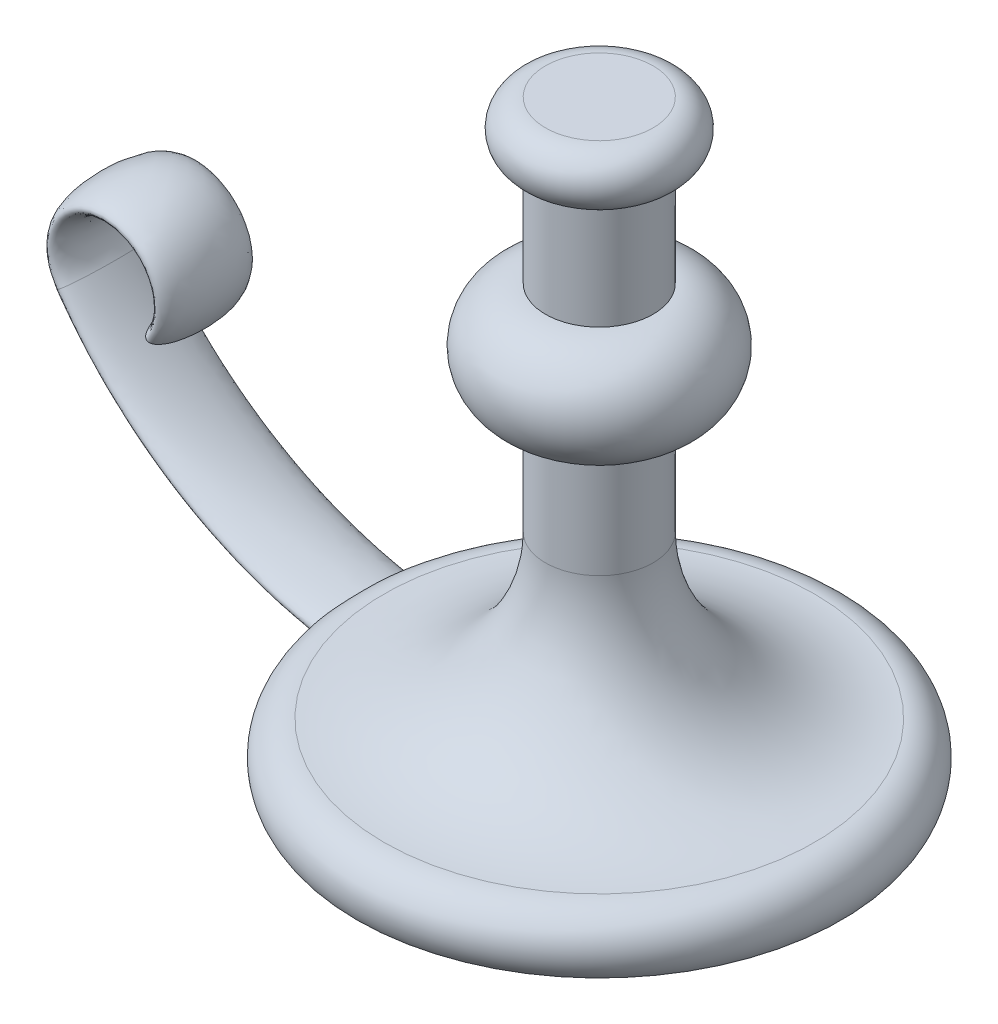
ISO-10303-21;
HEADER;
FILE_DESCRIPTION(('STEP AP214'),'2;1');
FILE_NAME('part.step','',(''),(''),'','','');
FILE_SCHEMA(('AUTOMOTIVE_DESIGN { 1 0 10303 214 1 1 1 1 }'));
ENDSEC;
DATA;
#1=APPLICATION_CONTEXT('core data for automotive mechanical design processes');
#2=APPLICATION_PROTOCOL_DEFINITION('international standard','automotive_design',2000,#1);
#3=PRODUCT_CONTEXT('',#1,'mechanical');
#4=PRODUCT('Part','Part','',(#3));
#5=PRODUCT_RELATED_PRODUCT_CATEGORY('part','',(#4));
#6=PRODUCT_DEFINITION_FORMATION('','',#4);
#7=PRODUCT_DEFINITION_CONTEXT('part definition',#1,'design');
#8=PRODUCT_DEFINITION('design','',#6,#7);
#9=PRODUCT_DEFINITION_SHAPE('','',#8);
#10=(LENGTH_UNIT() NAMED_UNIT(*) SI_UNIT(.MILLI.,.METRE.));
#11=(NAMED_UNIT(*) PLANE_ANGLE_UNIT() SI_UNIT($,.RADIAN.));
#12=(NAMED_UNIT(*) SI_UNIT($,.STERADIAN.) SOLID_ANGLE_UNIT());
#13=UNCERTAINTY_MEASURE_WITH_UNIT(LENGTH_MEASURE(1.E-05),#10,'distance_accuracy_value','');
#14=(GEOMETRIC_REPRESENTATION_CONTEXT(3) GLOBAL_UNCERTAINTY_ASSIGNED_CONTEXT((#13)) GLOBAL_UNIT_ASSIGNED_CONTEXT((#10,
#11,#12)) REPRESENTATION_CONTEXT('',''));
#15=CARTESIAN_POINT('',(0.,0.,0.));
#16=DIRECTION('',(0.,0.,1.));
#17=DIRECTION('',(1.,0.,0.));
#18=AXIS2_PLACEMENT_3D('',#15,#16,#17);
#19=CARTESIAN_POINT('',(0.,7.49999999999998,0.));
#20=DIRECTION('',(0.,-1.,0.));
#21=DIRECTION('',(0.,0.,-1.));
#22=AXIS2_PLACEMENT_3D('',#19,#20,#21);
#23=TOROIDAL_SURFACE('',#22,80.,12.5);
#24=CARTESIAN_POINT('',(0.,0.,0.));
#25=DIRECTION('',(0.,-1.,0.));
#26=DIRECTION('',(0.,0.,-1.));
#27=AXIS2_PLACEMENT_3D('',#24,#25,#26);
#28=CIRCLE('',#27,90.);
#29=CARTESIAN_POINT('',(0.,0.,-90.));
#30=VERTEX_POINT('',#29);
#31=EDGE_CURVE('E74',#30,#30,#28,.T.);
#32=ORIENTED_EDGE('',*,*,#31,.F.);
#33=EDGE_LOOP('',(#32));
#34=FACE_BOUND('',#33,.T.);
#35=CARTESIAN_POINT('',(0.,20.,0.));
#36=DIRECTION('',(0.,-1.,0.));
#37=DIRECTION('',(0.,0.,-1.));
#38=AXIS2_PLACEMENT_3D('',#35,#36,#37);
#39=CIRCLE('',#38,80.);
#40=CARTESIAN_POINT('',(0.,20.,-80.));
#41=VERTEX_POINT('',#40);
#42=EDGE_CURVE('E70',#41,#41,#39,.T.);
#43=ORIENTED_EDGE('',*,*,#42,.T.);
#44=EDGE_LOOP('',(#43));
#45=FACE_BOUND('',#44,.T.);
#46=CARTESIAN_POINT('',(-89.5597422043341,12.9414346567556,-17.5));
#47=CARTESIAN_POINT('',(-89.5390618403561,12.9834100865229,-17.4999996776707));
#48=CARTESIAN_POINT('',(-89.5184817634659,13.0254349004938,-17.4978446678338));
#49=CARTESIAN_POINT('',(-89.4776811982743,13.1092324497794,-17.4892861575811));
#50=CARTESIAN_POINT('',(-89.457460843071,13.1510050881611,-17.4828811168849));
#51=CARTESIAN_POINT('',(-89.3975402811209,13.2754779151414,-17.4575154450276));
#52=CARTESIAN_POINT('',(-89.3585808220613,13.357332519418,-17.4324042670614));
#53=CARTESIAN_POINT('',(-89.2734407804368,13.5379179993389,-17.3597430943198));
#54=CARTESIAN_POINT('',(-89.2281116968574,13.6353152430682,-17.3079906529225));
#55=CARTESIAN_POINT('',(-89.1421567137609,13.8217570109409,-17.1881654215547));
#56=CARTESIAN_POINT('',(-89.10154096816,13.9107834263932,-17.1200583326704));
#57=CARTESIAN_POINT('',(-89.0298799325304,14.0690063055582,-16.9825317839868));
#58=CARTESIAN_POINT('',(-88.9982856031081,14.1392491335227,-16.9145677994464));
#59=CARTESIAN_POINT('',(-88.9378435588022,14.2742914925202,-16.7722502997375));
#60=CARTESIAN_POINT('',(-88.9089980734781,14.3390866000317,-16.6978916893925));
#61=CARTESIAN_POINT('',(-88.8536099995593,14.4639626152392,-16.5442177801531));
#62=CARTESIAN_POINT('',(-88.8270733532936,14.5240313225779,-16.4648905452803));
#63=CARTESIAN_POINT('',(-88.7760376587063,14.6398576639347,-16.3025863942461));
#64=CARTESIAN_POINT('',(-88.7515379613228,14.6956166708123,-16.2196106536441));
#65=CARTESIAN_POINT('',(-88.704732820549,14.8023169553036,-16.052427362784));
#66=CARTESIAN_POINT('',(-88.6823939519366,14.8533308765833,-15.9682752160745));
#67=CARTESIAN_POINT('',(-88.639155365759,14.9521540950118,-15.7977416210759));
#68=CARTESIAN_POINT('',(-88.6182558899721,14.9999628537458,-15.711359801597));
#69=CARTESIAN_POINT('',(-88.5573681790008,15.1392585624723,-15.4492483073625));
#70=CARTESIAN_POINT('',(-88.5192579811328,15.2264609786255,-15.2707999543232));
#71=CARTESIAN_POINT('',(-88.4468979005836,15.3916731276291,-14.9088289385944));
#72=CARTESIAN_POINT('',(-88.4126513155026,15.4696750103546,-14.725302105289));
#73=CARTESIAN_POINT('',(-88.3471391595039,15.6182965032923,-14.3538259785736));
#74=CARTESIAN_POINT('',(-88.3158872528146,15.6888824046965,-14.1658608782527));
#75=CARTESIAN_POINT('',(-88.2560127035516,15.8233792512431,-13.7874003918539));
#76=CARTESIAN_POINT('',(-88.2273872233002,15.8872974109117,-13.5969079973402));
#77=CARTESIAN_POINT('',(-88.1723348827448,16.0094159388249,-13.213849673779));
#78=CARTESIAN_POINT('',(-88.1459074726895,16.06761773743,-13.021284276893));
#79=CARTESIAN_POINT('',(-88.0884248304701,16.1932687928886,-12.5849658119247));
#80=CARTESIAN_POINT('',(-88.0579162002183,16.2592725226906,-12.3407253521734));
#81=CARTESIAN_POINT('',(-87.9994625659013,16.3844358500305,-11.8501803460781));
#82=CARTESIAN_POINT('',(-87.9715178234088,16.4435947494061,-11.6038755919222));
#83=CARTESIAN_POINT('',(-87.9178897421858,16.5558889779776,-11.1095299870479));
#84=CARTESIAN_POINT('',(-87.8922075114269,16.6090213595568,-10.8614883492399));
#85=CARTESIAN_POINT('',(-87.8429155378603,16.7098546386226,-10.3640943607017));
#86=CARTESIAN_POINT('',(-87.8193058942811,16.7575552760879,-10.114741947821));
#87=CARTESIAN_POINT('',(-87.7514718906047,16.8930622945828,-9.36631396644898));
#88=CARTESIAN_POINT('',(-87.710111419914,16.97354616682,-8.86564202060313));
#89=CARTESIAN_POINT('',(-87.6344118706353,17.1178657179368,-7.86153551840228));
#90=CARTESIAN_POINT('',(-87.600071334108,17.1817048544489,-7.35810155802564));
#91=CARTESIAN_POINT('',(-87.5383679228554,17.2943697092708,-6.35225136111874));
#92=CARTESIAN_POINT('',(-87.5109639050818,17.3432843238913,-5.84984753787556));
#93=CARTESIAN_POINT('',(-87.4628391630611,17.4279603163538,-4.8435422883101));
#94=CARTESIAN_POINT('',(-87.4421195253372,17.4637195559667,-4.3396406319409));
#95=CARTESIAN_POINT('',(-87.4074386787954,17.5229738360404,-3.33084363886013));
#96=CARTESIAN_POINT('',(-87.3934780874881,17.5464677559495,-2.82594821558681));
#97=CARTESIAN_POINT('',(-87.3724154174235,17.5817273168609,-1.81615213380803));
#98=CARTESIAN_POINT('',(-87.3653059747339,17.5935055508652,-1.3112520655452));
#99=CARTESIAN_POINT('',(-87.3579750479624,17.6056484066489,-0.301318309132907));
#100=CARTESIAN_POINT('',(-87.357752858235,17.6060141977103,0.203715360026094));
#101=CARTESIAN_POINT('',(-87.3641963426438,17.5953454261038,1.2135672655417));
#102=CARTESIAN_POINT('',(-87.3708612610896,17.5843121142068,1.71838551945509));
#103=CARTESIAN_POINT('',(-87.3886163883338,17.554616306541,2.60695068649853));
#104=CARTESIAN_POINT('',(-87.3982690399213,17.5384060734754,2.9908104647884));
#105=CARTESIAN_POINT('',(-87.4214966880659,17.4990063104014,3.75807002785712));
#106=CARTESIAN_POINT('',(-87.435071823598,17.4758165331044,4.14146979585428));
#107=CARTESIAN_POINT('',(-87.4661109016121,17.4221255760208,4.9076754376321));
#108=CARTESIAN_POINT('',(-87.4835755913649,17.3916229911934,5.2904811830376));
#109=CARTESIAN_POINT('',(-87.5224765269599,17.3226675403927,6.05728766608037));
#110=CARTESIAN_POINT('',(-87.5439339089184,17.2841722314846,6.44128353835443));
#111=CARTESIAN_POINT('',(-87.5907685418077,17.1987228636429,7.20803081067558));
#112=CARTESIAN_POINT('',(-87.6161451191905,17.1517702579396,7.59078241304232));
#113=CARTESIAN_POINT('',(-87.6708875244928,17.0486132676472,8.35453102594116));
#114=CARTESIAN_POINT('',(-87.7002509792863,16.9924143825779,8.73552894189138));
#115=CARTESIAN_POINT('',(-87.7555693385741,16.8844873931684,9.40362807317348));
#116=CARTESIAN_POINT('',(-87.780631862629,16.8349635590468,9.69115955865564));
#117=CARTESIAN_POINT('',(-87.8333287645207,16.7293167465828,10.2648242071223));
#118=CARTESIAN_POINT('',(-87.8609635304672,16.6731927720484,10.5509571522123));
#119=CARTESIAN_POINT('',(-87.9190678138249,16.5534902310351,11.1217112831613));
#120=CARTESIAN_POINT('',(-87.9495404231884,16.4899035134826,11.4063304543325));
#121=CARTESIAN_POINT('',(-88.0137266324376,16.3541216812726,11.9738772339477));
#122=CARTESIAN_POINT('',(-88.0474477220507,16.2819065762201,12.2567992545898));
#123=CARTESIAN_POINT('',(-88.1183718381953,16.1280994435204,12.8175821097589));
#124=CARTESIAN_POINT('',(-88.1555499028383,16.046573796357,13.0954641920682));
#125=CARTESIAN_POINT('',(-88.2343580118385,15.8719007074313,13.6468218234687));
#126=CARTESIAN_POINT('',(-88.2759857295858,15.7787593350285,13.9202995902183));
#127=CARTESIAN_POINT('',(-88.3426568223939,15.6283840406489,14.3254052817092));
#128=CARTESIAN_POINT('',(-88.3655500017785,15.5765627213432,14.4594023169281));
#129=CARTESIAN_POINT('',(-88.4129882653633,15.4688611687534,14.7254525655376));
#130=CARTESIAN_POINT('',(-88.437533168995,15.4129813790935,14.8575059894887));
#131=CARTESIAN_POINT('',(-88.4884967907572,15.296726972035,15.1188747284344));
#132=CARTESIAN_POINT('',(-88.5149109123158,15.2363633637365,15.248195809858));
#133=CARTESIAN_POINT('',(-88.5700241751771,15.1103179001211,15.5037035642082));
#134=CARTESIAN_POINT('',(-88.5987227483177,15.0446373670988,15.6298910063173));
#135=CARTESIAN_POINT('',(-88.6570151826477,14.9113179601608,15.870419970706));
#136=CARTESIAN_POINT('',(-88.686441736786,14.8440563407289,15.9850095995261));
#137=CARTESIAN_POINT('',(-88.7482816567768,14.7030103830826,16.2094581395953));
#138=CARTESIAN_POINT('',(-88.7806974756141,14.629220689998,16.3193130551169));
#139=CARTESIAN_POINT('',(-88.8489097184972,14.4745639616531,16.5315146626624));
#140=CARTESIAN_POINT('',(-88.8846785573508,14.3937550191611,16.6339121024916));
#141=CARTESIAN_POINT('',(-88.9606113704153,14.2232561160766,16.8291907541922));
#142=CARTESIAN_POINT('',(-89.0007675950254,14.1335818404865,16.9220882016583));
#143=CARTESIAN_POINT('',(-89.0601235459873,14.0021924630805,17.0411637727685));
#144=CARTESIAN_POINT('',(-89.0770574086405,13.9648250339927,17.073294917827));
#145=CARTESIAN_POINT('',(-89.1117704043089,13.8885105828123,17.1351129203988));
#146=CARTESIAN_POINT('',(-89.1295494801998,13.8495636674961,17.1647999427302));
#147=CARTESIAN_POINT('',(-89.1842722230347,13.7301865324198,17.2496672583031));
#148=CARTESIAN_POINT('',(-89.2225929343976,13.6472387371287,17.3006362954167));
#149=CARTESIAN_POINT('',(-89.2830198855204,13.5177923286576,17.3659392171785));
#150=CARTESIAN_POINT('',(-89.3038035106325,13.4734899832391,17.385944655127));
#151=CARTESIAN_POINT('',(-89.346235727213,13.3835498526412,17.421521231844));
#152=CARTESIAN_POINT('',(-89.3678838017235,13.3379128698458,17.4370949768747));
#153=CARTESIAN_POINT('',(-89.411904802424,13.2456714845448,17.4633118273198));
#154=CARTESIAN_POINT('',(-89.4342765183816,13.1990687398024,17.4739627514632));
#155=CARTESIAN_POINT('',(-89.4796070415906,13.1052444737537,17.4900003628641));
#156=CARTESIAN_POINT('',(-89.5025657624808,13.0580230439622,17.495387819971));
#157=CARTESIAN_POINT('',(-89.5464271716017,12.9684112208445,17.5004320668286));
#158=CARTESIAN_POINT('',(-89.5672934245651,12.9260327119426,17.5006298436875));
#159=CARTESIAN_POINT('',(-89.6091580078856,12.8415284156483,17.496667300483));
#160=CARTESIAN_POINT('',(-89.6301563797468,12.7994027167221,17.4925055351934));
#161=CARTESIAN_POINT('',(-89.672115635143,12.7157496198108,17.479965082583));
#162=CARTESIAN_POINT('',(-89.6930765014329,12.6742224548788,17.4715847960013));
#163=CARTESIAN_POINT('',(-89.7348115258834,12.5920532516238,17.450862522026));
#164=CARTESIAN_POINT('',(-89.7555855765781,12.5514117057388,17.4385183877269));
#165=CARTESIAN_POINT('',(-89.8013847331777,12.4623676182577,17.4070626989759));
#166=CARTESIAN_POINT('',(-89.8263321178974,12.4142402057078,17.3870577635768));
#167=CARTESIAN_POINT('',(-89.8756026524762,12.3198942829529,17.3423007335127));
#168=CARTESIAN_POINT('',(-89.8999253272691,12.2736772101063,17.317545140678));
#169=CARTESIAN_POINT('',(-89.9718636752115,12.1379719567038,17.2371059859825));
#170=CARTESIAN_POINT('',(-90.0184026508768,12.051520920799,17.1752845379973));
#171=CARTESIAN_POINT('',(-90.1015176697338,11.8991704299986,17.0502729237444));
#172=CARTESIAN_POINT('',(-90.1385373685484,11.832138329749,16.9886971231214));
#173=CARTESIAN_POINT('',(-90.2104869329279,11.7032426034951,16.8591573255862));
#174=CARTESIAN_POINT('',(-90.2454151408799,11.6413830620089,16.7911883686367));
#175=CARTESIAN_POINT('',(-90.3133841124365,11.5222099067342,16.6502911436157));
#176=CARTESIAN_POINT('',(-90.3464212107124,11.4649050425,16.577353807455));
#177=CARTESIAN_POINT('',(-90.4107258034174,11.3544143267812,16.427734996584));
#178=CARTESIAN_POINT('',(-90.4419937497579,11.3012274221162,16.3510544874358));
#179=CARTESIAN_POINT('',(-90.5066142435688,11.1922810586096,16.185318952537));
#180=CARTESIAN_POINT('',(-90.5397652495639,11.1369814833086,16.0958847835331));
#181=CARTESIAN_POINT('',(-90.6043042941241,11.0303194621557,15.9140859303205));
#182=CARTESIAN_POINT('',(-90.6356921559875,10.9789574107339,15.8217209538335));
#183=CARTESIAN_POINT('',(-90.6968383877971,10.8797698841651,15.6347974994413));
#184=CARTESIAN_POINT('',(-90.7265992701636,10.8319389137697,15.540242744142));
#185=CARTESIAN_POINT('',(-90.7846969346251,10.7393295137681,15.3492353522605));
#186=CARTESIAN_POINT('',(-90.8130337948204,10.6945509167066,15.2527828201663));
#187=CARTESIAN_POINT('',(-90.8771212205239,10.5940589597549,15.0277319837683));
#188=CARTESIAN_POINT('',(-90.9124022819657,10.5393328792865,14.8985593440141));
#189=CARTESIAN_POINT('',(-90.9809741103801,10.4339610325184,14.6380328432609));
#190=CARTESIAN_POINT('',(-91.0142645951402,10.3833158444317,14.5066786763347));
#191=CARTESIAN_POINT('',(-91.1115171918213,10.2366440116076,14.109681091878));
#192=CARTESIAN_POINT('',(-91.1727828792966,10.1460018602114,13.8413800425918));
#193=CARTESIAN_POINT('',(-91.289286281246,9.97615455726911,13.2997906638458));
#194=CARTESIAN_POINT('',(-91.3445203789087,9.89695625887035,13.0264994554535));
#195=CARTESIAN_POINT('',(-91.449980571998,9.74769654866264,12.4748594155947));
#196=CARTESIAN_POINT('',(-91.5001780442571,9.67768673078016,12.1964912536697));
#197=CARTESIAN_POINT('',(-91.5957501918067,9.54592534416385,11.6372393425743));
#198=CARTESIAN_POINT('',(-91.6411285723793,9.48416742117628,11.3563577087905));
#199=CARTESIAN_POINT('',(-91.7275132616963,9.36779787162547,10.7925089006675));
#200=CARTESIAN_POINT('',(-91.7685202729419,9.31318509647923,10.5095420692681));
#201=CARTESIAN_POINT('',(-91.8503345045436,9.20520508711805,9.91387150213588));
#202=CARTESIAN_POINT('',(-91.8907217744488,9.15249390095811,9.60099168323568));
#203=CARTESIAN_POINT('',(-91.9669218199109,9.05389158705532,8.97359688181904));
#204=CARTESIAN_POINT('',(-92.002734366163,9.00800080116138,8.65908181815878));
#205=CARTESIAN_POINT('',(-92.07003298894,8.92240020575307,8.02865568808712));
#206=CARTESIAN_POINT('',(-92.1015177516249,8.88269227276195,7.71274422766427));
#207=CARTESIAN_POINT('',(-92.1603325838502,8.80898713679304,7.07986626810544));
#208=CARTESIAN_POINT('',(-92.1876625005419,8.77499014390499,6.76289973059333));
#209=CARTESIAN_POINT('',(-92.263503001365,8.68114273902097,5.81249868362168));
#210=CARTESIAN_POINT('',(-92.3060517448553,8.6291999949219,5.17778747193793));
#211=CARTESIAN_POINT('',(-92.3760091017524,8.54431318450689,3.90627938186772));
#212=CARTESIAN_POINT('',(-92.4034169750229,8.51137004695188,3.26948240305235));
#213=CARTESIAN_POINT('',(-92.4435085691828,8.46331702284119,1.99545741778392));
#214=CARTESIAN_POINT('',(-92.4562084043365,8.44818761908846,1.35823064985367));
#215=CARTESIAN_POINT('',(-92.4671302630246,8.43517103988551,0.0834423270810098));
#216=CARTESIAN_POINT('',(-92.4653514271759,8.43728488791032,-0.554119245387855));
#217=CARTESIAN_POINT('',(-92.4472853754492,8.45883344750921,-1.82886328296965));
#218=CARTESIAN_POINT('',(-92.4309954438924,8.47827140120326,-2.46604565478078));
#219=CARTESIAN_POINT('',(-92.3836590626409,8.53514174464791,-3.73902583866986));
#220=CARTESIAN_POINT('',(-92.3526140808133,8.57257234445218,-4.37482378215485));
#221=CARTESIAN_POINT('',(-92.2921790866404,8.64621329194993,-5.3662554446096));
#222=CARTESIAN_POINT('',(-92.2680118235608,8.67578736963477,-5.72271555901846));
#223=CARTESIAN_POINT('',(-92.2147013952354,8.74146404735387,-6.43465819603276));
#224=CARTESIAN_POINT('',(-92.1855583836333,8.77756644580533,-6.79014074847956));
#225=CARTESIAN_POINT('',(-92.1221127048893,8.85679311513346,-7.49983836059457));
#226=CARTESIAN_POINT('',(-92.0878103957549,8.89991689880819,-7.85405350646439));
#227=CARTESIAN_POINT('',(-92.0137981226249,8.99384143269643,-8.56089767223892));
#228=CARTESIAN_POINT('',(-91.9740883343956,9.04464193338972,-8.91352674331313));
#229=CARTESIAN_POINT('',(-91.9015818240062,9.13842562293709,-9.51226790233087));
#230=CARTESIAN_POINT('',(-91.8702370654071,9.17924629619429,-9.75889575934176));
#231=CARTESIAN_POINT('',(-91.8045624920058,9.26550036635907,-10.25094196203));
#232=CARTESIAN_POINT('',(-91.770232756707,9.31093364041763,-10.4963603397374));
#233=CARTESIAN_POINT('',(-91.6984266463271,9.40685898724875,-10.9855805665734));
#234=CARTESIAN_POINT('',(-91.6609523533816,9.4573477168196,-11.2293833718165));
#235=CARTESIAN_POINT('',(-91.5826038967892,9.5640131709902,-11.7151775621046));
#236=CARTESIAN_POINT('',(-91.5417298772536,9.62018965451309,-11.9571690234573));
#237=CARTESIAN_POINT('',(-91.4386423376746,9.76351210996378,-12.5384162018483));
#238=CARTESIAN_POINT('',(-91.3745858903288,9.85386844470741,-12.876578655777));
#239=CARTESIAN_POINT('',(-91.2720163238267,10.0014015523806,-13.379313604131));
#240=CARTESIAN_POINT('',(-91.2367090969992,10.0526332971693,-13.5462966135006));
#241=CARTESIAN_POINT('',(-91.1637294936457,10.1596261841618,-13.8782853379554));
#242=CARTESIAN_POINT('',(-91.1260572231721,10.2153871233018,-14.0432911413073));
#243=CARTESIAN_POINT('',(-91.0448513753997,10.3369382727868,-14.3844416693127));
#244=CARTESIAN_POINT('',(-91.0010908407915,10.4031767890598,-14.5603739146114));
#245=CARTESIAN_POINT('',(-90.9100440331646,10.5428509324198,-14.908531165983));
#246=CARTESIAN_POINT('',(-90.8627565865346,10.6162889577863,-15.0807549132313));
#247=CARTESIAN_POINT('',(-90.7642492199854,10.7715651970481,-15.4195496037303));
#248=CARTESIAN_POINT('',(-90.7130423069866,10.8533759065568,-15.5861368065584));
#249=CARTESIAN_POINT('',(-90.6058220172113,11.0275348916429,-15.9120386126949));
#250=CARTESIAN_POINT('',(-90.5498128203452,11.1198740259081,-16.0713593593323));
#251=CARTESIAN_POINT('',(-90.4444082893051,11.2969255920341,-16.346591008204));
#252=CARTESIAN_POINT('',(-90.3961277047704,11.3791055101425,-16.4645448336189));
#253=CARTESIAN_POINT('',(-90.2950977924847,11.5538633486867,-16.6911566146551));
#254=CARTESIAN_POINT('',(-90.2423390562531,11.6464633011953,-16.7997939840167));
#255=CARTESIAN_POINT('',(-90.1590440243456,11.7953014200273,-16.9524870890686));
#256=CARTESIAN_POINT('',(-90.1303607600847,11.8469859215397,-17.0019977189781));
#257=CARTESIAN_POINT('',(-90.0716181087374,11.953827456151,-17.0963102611099));
#258=CARTESIAN_POINT('',(-90.0415584049394,12.0089852895524,-17.1411110817339));
#259=CARTESIAN_POINT('',(-89.9801756575595,12.122724663209,-17.2246441347398));
#260=CARTESIAN_POINT('',(-89.948857753765,12.1812926416249,-17.2633984155372));
#261=CARTESIAN_POINT('',(-89.8849549671328,12.3020144005062,-17.3335784406431));
#262=CARTESIAN_POINT('',(-89.8523712452273,12.3641649194655,-17.3650107233704));
#263=CARTESIAN_POINT('',(-89.7981176909034,12.4687258013536,-17.4092508881815));
#264=CARTESIAN_POINT('',(-89.7767436177655,12.5101841078546,-17.4246893204628));
#265=CARTESIAN_POINT('',(-89.7336969050674,12.5942336377178,-17.4515182330193));
#266=CARTESIAN_POINT('',(-89.7120243813912,12.636824427018,-17.4629102408533));
#267=CARTESIAN_POINT('',(-89.6685521390583,12.7228207531292,-17.4812886417918));
#268=CARTESIAN_POINT('',(-89.6467526103346,12.766225219827,-17.488280453409));
#269=CARTESIAN_POINT('',(-89.6031794397246,12.8535466229688,-17.4976362320133));
#270=CARTESIAN_POINT('',(-89.5814057970822,12.8974635440192,-17.5000003376542));
#271=CARTESIAN_POINT('',(-89.5597422043341,12.9414346567556,-17.5));
#272=B_SPLINE_CURVE_WITH_KNOTS('',3,(#46,#47,#48,#49,#50,#51,#52,#53,#54,#55,#56,#57,#58,#59,
#60,#61,#62,#63,#64,#65,#66,#67,#68,#69,#70,#71,#72,#73,#74,#75,#76,#77,#78,#79,#80,#81,#82,#83,
#84,#85,#86,#87,#88,#89,#90,#91,#92,#93,#94,#95,#96,#97,#98,#99,#100,#101,#102,#103,#104,#105,
#106,#107,#108,#109,#110,#111,#112,#113,#114,#115,#116,#117,#118,#119,#120,#121,#122,#123,#124,
#125,#126,#127,#128,#129,#130,#131,#132,#133,#134,#135,#136,#137,#138,#139,#140,#141,#142,#143,
#144,#145,#146,#147,#148,#149,#150,#151,#152,#153,#154,#155,#156,#157,#158,#159,#160,#161,#162,
#163,#164,#165,#166,#167,#168,#169,#170,#171,#172,#173,#174,#175,#176,#177,#178,#179,#180,#181,
#182,#183,#184,#185,#186,#187,#188,#189,#190,#191,#192,#193,#194,#195,#196,#197,#198,#199,#200,
#201,#202,#203,#204,#205,#206,#207,#208,#209,#210,#211,#212,#213,#214,#215,#216,#217,#218,#219,
#220,#221,#222,#223,#224,#225,#226,#227,#228,#229,#230,#231,#232,#233,#234,#235,#236,#237,#238,
#239,#240,#241,#242,#243,#244,#245,#246,#247,#248,#249,#250,#251,#252,#253,#254,#255,#256,#257,
#258,#259,#260,#261,#262,#263,#264,#265,#266,#267,#268,#269,#270,#271),.UNSPECIFIED.,.T.,.F.,(4,
2,2,2,2,2,2,2,2,2,2,2,2,2,2,2,2,2,2,2,2,2,2,2,2,2,2,2,2,2,2,2,2,2,2,2,2,2,2,2,2,2,2,2,2,2,2,2,2,
2,2,2,2,2,2,2,2,2,2,2,2,2,2,2,2,2,2,2,2,2,2,2,2,2,2,2,2,2,2,2,2,2,2,2,2,2,2,2,2,2,2,2,2,2,2,2,2,
2,2,2,2,2,2,2,2,2,2,2,2,2,2,2,4),(0.,0.140326879649319,0.280704643844312,0.561461806499931,
0.917225717585783,1.27374235386082,1.58146302398144,1.88943119593638,2.19816989275472,
2.50680983170022,2.80944292372746,3.11212672643253,3.7183891577019,4.32516518168243,
4.9345897078254,5.54334784093534,6.15195325906645,6.91631911029042,7.68076285707084,
8.44557890144722,9.21043154271127,10.7363530227227,12.261957268085,13.7782885580523,
15.2948661984783,16.8115823682402,18.3266664767784,19.8415953542035,21.3563580231468,
22.5092504482307,23.6621837256808,24.8153386988898,25.974781379963,27.1340250219354,
28.2925816429425,29.1710242088838,30.0495995331114,30.9291435591542,31.8107663507034,
32.6864555684207,33.5616891298975,33.9980703124477,34.4344038665403,34.8696994156046,
35.304887039303,35.7129485465613,36.1213479397352,36.5266413619584,36.9312301321629,
37.087481072601,37.2437214677037,37.5562829439449,37.7147148343191,37.8730533580126,
38.0311395270882,38.1892025705741,38.3307149014328,38.4722741597123,38.6138871242241,
38.7555769191151,38.9286541005772,39.1018592207181,39.4485901352339,39.7429975955386,
40.0376353818191,40.3328261359407,40.6279411430422,40.9585479808935,41.2891878931729,
41.6193018978016,41.949397777569,42.38325515086,42.817173888797,43.6859467918768,
44.5552378220702,45.4292182663363,46.302521787528,47.1756847521812,48.1351081860333,
49.0945796914523,50.0543418354862,51.0141392787934,52.9283366636012,54.8426276125086,
56.7548192562813,58.6671243992165,60.5797874956865,62.4922603557698,63.5676819321849,
64.6430703071875,65.7183840946027,66.7936629380624,67.5494303160603,68.3051775707191,
69.0604283053776,69.8156470419353,70.8826765887352,71.4172057561799,71.9517109715329,
72.5305894861727,73.1096614946434,73.6868888443993,74.2636187787012,74.7180950553376,
75.1735510009089,75.4046853668802,75.6358731855896,75.8661972266865,76.0963147970918,
76.2435550398535,76.3907396389802,76.5377426347989,76.6847412260987),.UNSPECIFIED.);
#273=CARTESIAN_POINT('',(-89.5597422043341,12.9414346567556,-17.5));
#274=VERTEX_POINT('',#273);
#275=EDGE_CURVE('E41',#274,#274,#272,.T.);
#276=ORIENTED_EDGE('',*,*,#275,.T.);
#277=EDGE_LOOP('',(#276));
#278=FACE_BOUND('',#277,.T.);
#279=ADVANCED_FACE('F37',(#34,#45,#278),#23,.T.);
#280=CARTESIAN_POINT('',(0.,220.,0.));
#281=DIRECTION('',(0.,1.,0.));
#282=DIRECTION('',(0.,0.,1.));
#283=AXIS2_PLACEMENT_3D('',#280,#281,#282);
#284=PLANE('',#283);
#285=CARTESIAN_POINT('',(0.,220.,0.));
#286=DIRECTION('',(0.,-1.,0.));
#287=DIRECTION('',(0.,0.,-1.));
#288=AXIS2_PLACEMENT_3D('',#285,#286,#287);
#289=CIRCLE('',#288,20.);
#290=CARTESIAN_POINT('',(0.,220.,-20.));
#291=VERTEX_POINT('',#290);
#292=EDGE_CURVE('E10',#291,#291,#289,.T.);
#293=ORIENTED_EDGE('',*,*,#292,.F.);
#294=EDGE_LOOP('',(#293));
#295=FACE_BOUND('',#294,.T.);
#296=ADVANCED_FACE('F39',(#295),#284,.T.);
#297=CARTESIAN_POINT('',(0.,210.,0.));
#298=DIRECTION('',(0.,-1.,0.));
#299=DIRECTION('',(0.,0.,-1.));
#300=AXIS2_PLACEMENT_3D('',#297,#298,#299);
#301=TOROIDAL_SURFACE('',#300,20.,10.);
#302=ORIENTED_EDGE('',*,*,#292,.T.);
#303=EDGE_LOOP('',(#302));
#304=FACE_BOUND('',#303,.T.);
#305=CARTESIAN_POINT('',(0.,200.,0.));
#306=DIRECTION('',(0.,-1.,0.));
#307=DIRECTION('',(0.,0.,-1.));
#308=AXIS2_PLACEMENT_3D('',#305,#306,#307);
#309=CIRCLE('',#308,20.);
#310=CARTESIAN_POINT('',(0.,200.,-20.));
#311=VERTEX_POINT('',#310);
#312=EDGE_CURVE('E51',#311,#311,#309,.T.);
#313=ORIENTED_EDGE('',*,*,#312,.F.);
#314=EDGE_LOOP('',(#313));
#315=FACE_BOUND('',#314,.T.);
#316=ADVANCED_FACE('F111',(#304,#315),#301,.T.);
#317=CARTESIAN_POINT('',(0.,0.,0.));
#318=DIRECTION('',(0.,-1.,0.));
#319=DIRECTION('',(0.,0.,-1.));
#320=AXIS2_PLACEMENT_3D('',#317,#318,#319);
#321=CYLINDRICAL_SURFACE('',#320,20.);
#322=ORIENTED_EDGE('',*,*,#312,.T.);
#323=EDGE_LOOP('',(#322));
#324=FACE_BOUND('',#323,.T.);
#325=CARTESIAN_POINT('',(0.,160.,0.));
#326=DIRECTION('',(0.,-1.,0.));
#327=DIRECTION('',(0.,0.,-1.));
#328=AXIS2_PLACEMENT_3D('',#325,#326,#327);
#329=CIRCLE('',#328,20.);
#330=CARTESIAN_POINT('',(0.,160.,-20.));
#331=VERTEX_POINT('',#330);
#332=EDGE_CURVE('E56',#331,#331,#329,.T.);
#333=ORIENTED_EDGE('',*,*,#332,.F.);
#334=EDGE_LOOP('',(#333));
#335=FACE_BOUND('',#334,.T.);
#336=ADVANCED_FACE('F127',(#324,#335),#321,.T.);
#337=CARTESIAN_POINT('',(0.,140.,0.));
#338=DIRECTION('',(0.,-1.,0.));
#339=DIRECTION('',(0.,0.,-1.));
#340=AXIS2_PLACEMENT_3D('',#337,#338,#339);
#341=DEGENERATE_TOROIDAL_SURFACE('',#340,20.,20.,.T.);
#342=ORIENTED_EDGE('',*,*,#332,.T.);
#343=EDGE_LOOP('',(#342));
#344=FACE_BOUND('',#343,.T.);
#345=CARTESIAN_POINT('',(0.,120.,0.));
#346=DIRECTION('',(0.,-1.,0.));
#347=DIRECTION('',(0.,0.,-1.));
#348=AXIS2_PLACEMENT_3D('',#345,#346,#347);
#349=CIRCLE('',#348,20.);
#350=CARTESIAN_POINT('',(0.,120.,-20.));
#351=VERTEX_POINT('',#350);
#352=EDGE_CURVE('E62',#351,#351,#349,.T.);
#353=ORIENTED_EDGE('',*,*,#352,.F.);
#354=EDGE_LOOP('',(#353));
#355=FACE_BOUND('',#354,.T.);
#356=ADVANCED_FACE('F123',(#344,#355),#341,.T.);
#357=CARTESIAN_POINT('',(0.,0.,0.));
#358=DIRECTION('',(0.,-1.,0.));
#359=DIRECTION('',(0.,0.,-1.));
#360=AXIS2_PLACEMENT_3D('',#357,#358,#359);
#361=CYLINDRICAL_SURFACE('',#360,20.);
#362=ORIENTED_EDGE('',*,*,#352,.T.);
#363=EDGE_LOOP('',(#362));
#364=FACE_BOUND('',#363,.T.);
#365=CARTESIAN_POINT('',(0.,80.,0.));
#366=DIRECTION('',(0.,-1.,0.));
#367=DIRECTION('',(0.,0.,-1.));
#368=AXIS2_PLACEMENT_3D('',#365,#366,#367);
#369=CIRCLE('',#368,20.);
#370=CARTESIAN_POINT('',(0.,80.,-20.));
#371=VERTEX_POINT('',#370);
#372=EDGE_CURVE('E66',#371,#371,#369,.T.);
#373=ORIENTED_EDGE('',*,*,#372,.F.);
#374=EDGE_LOOP('',(#373));
#375=FACE_BOUND('',#374,.T.);
#376=ADVANCED_FACE('F119',(#364,#375),#361,.T.);
#377=CARTESIAN_POINT('',(0.,80.,0.));
#378=DIRECTION('',(0.,-1.,0.));
#379=DIRECTION('',(0.,0.,-1.));
#380=AXIS2_PLACEMENT_3D('',#377,#378,#379);
#381=TOROIDAL_SURFACE('',#380,80.,60.);
#382=ORIENTED_EDGE('',*,*,#372,.T.);
#383=EDGE_LOOP('',(#382));
#384=FACE_BOUND('',#383,.T.);
#385=ORIENTED_EDGE('',*,*,#42,.F.);
#386=EDGE_LOOP('',(#385));
#387=FACE_BOUND('',#386,.T.);
#388=ADVANCED_FACE('F103',(#384,#387),#381,.F.);
#389=CARTESIAN_POINT('',(0.,0.,0.));
#390=DIRECTION('',(0.,-1.,0.));
#391=DIRECTION('',(0.,0.,-1.));
#392=AXIS2_PLACEMENT_3D('',#389,#390,#391);
#393=PLANE('',#392);
#394=ORIENTED_EDGE('',*,*,#31,.T.);
#395=EDGE_LOOP('',(#394));
#396=FACE_BOUND('',#395,.T.);
#397=ADVANCED_FACE('F93',(#396),#393,.T.);
#398=CARTESIAN_POINT('',(-150.634185358261,75.,0.));
#399=DIRECTION('',(0.566666666666667,0.823947139620552,0.));
#400=DIRECTION('',(0.,0.,-1.));
#401=AXIS2_PLACEMENT_3D('',#398,#399,#400);
#402=PLANE('',#401);
#403=CARTESIAN_POINT('',(-150.634185358261,75.,0.));
#404=DIRECTION('',(0.566666666666667,0.823947139620552,0.));
#405=DIRECTION('',(0.,0.,-1.));
#406=AXIS2_PLACEMENT_3D('',#403,#404,#405);
#407=ELLIPSE('',#406,17.5,5.);
#408=CARTESIAN_POINT('',(-150.634185358261,75.,-17.5));
#409=VERTEX_POINT('',#408);
#410=EDGE_CURVE('E78',#409,#409,#407,.T.);
#411=ORIENTED_EDGE('',*,*,#410,.F.);
#412=EDGE_LOOP('',(#411));
#413=FACE_BOUND('',#412,.T.);
#414=ADVANCED_FACE('F97',(#413),#402,.F.);
#415=CARTESIAN_POINT('',(-60.,10.,-17.5));
#416=CARTESIAN_POINT('',(-110.410191303973,10.,-17.5));
#417=CARTESIAN_POINT('',(-155.026295870831,33.4646670673665,-17.5));
#418=CARTESIAN_POINT('',(-183.592070943083,75.,-17.5));
#419=CARTESIAN_POINT('',(-60.,20.,-17.5));
#420=CARTESIAN_POINT('',(-107.049511883708,20.,-17.5));
#421=CARTESIAN_POINT('',(-148.691209479443,41.9003559295421,-17.5));
#422=CARTESIAN_POINT('',(-175.352599546877,80.6666666666666,-17.5));
#423=CARTESIAN_POINT('',(-60.,20.,17.5));
#424=CARTESIAN_POINT('',(-107.049511883708,20.,17.5));
#425=CARTESIAN_POINT('',(-148.691209479443,41.9003559295421,17.5));
#426=CARTESIAN_POINT('',(-175.352599546877,80.6666666666666,17.5));
#427=CARTESIAN_POINT('',(-60.,10.,17.5));
#428=CARTESIAN_POINT('',(-110.410191303973,10.,17.5));
#429=CARTESIAN_POINT('',(-155.026295870831,33.4646670673665,17.5));
#430=CARTESIAN_POINT('',(-183.592070943083,75.,17.5));
#431=CARTESIAN_POINT('',(-60.,0.,17.5));
#432=CARTESIAN_POINT('',(-113.770870724238,0.,17.5));
#433=CARTESIAN_POINT('',(-161.36138226222,25.0289782051909,17.5));
#434=CARTESIAN_POINT('',(-191.831542339288,69.3333333333333,17.5));
#435=CARTESIAN_POINT('',(-60.,0.,-17.5));
#436=CARTESIAN_POINT('',(-113.770870724238,0.,-17.5));
#437=CARTESIAN_POINT('',(-161.36138226222,25.0289782051909,-17.5));
#438=CARTESIAN_POINT('',(-191.831542339288,69.3333333333333,-17.5));
#439=CARTESIAN_POINT('',(-60.,10.,-17.5));
#440=CARTESIAN_POINT('',(-110.410191303973,10.,-17.5));
#441=CARTESIAN_POINT('',(-155.026295870831,33.4646670673665,-17.5));
#442=CARTESIAN_POINT('',(-183.592070943083,75.,-17.5));
#443=(BOUNDED_SURFACE() B_SPLINE_SURFACE(3,3,((#415,#416,#417,#418),(#419,#420,#421,#422),(#423,
#424,#425,#426),(#427,#428,#429,#430),(#431,#432,#433,#434),(#435,#436,#437,#438),(#439,#440,
#441,#442)),.UNSPECIFIED.,.T.,.F.,.F.) B_SPLINE_SURFACE_WITH_KNOTS((4,3,4),(4,4),(0.,0.5,1.),
(0.,1.),.UNSPECIFIED.) GEOMETRIC_REPRESENTATION_ITEM() RATIONAL_B_SPLINE_SURFACE(((1.,
0.923374135437856,0.923374135437856,1.),(0.333333333333333,0.307791378479285,0.307791378479285,
0.333333333333333),(0.333333333333333,0.307791378479285,0.307791378479285,0.333333333333333),
(1.,0.923374135437856,0.923374135437856,1.),(0.333333333333333,0.307791378479285,
0.307791378479285,0.333333333333333),(0.333333333333333,0.307791378479285,0.307791378479285,
0.333333333333333),(1.,0.923374135437856,0.923374135437856,1.))) REPRESENTATION_ITEM('') SURFACE());
#444=CARTESIAN_POINT('',(-183.592070943083,75.,0.));
#445=DIRECTION('',(0.566666666666667,-0.823947139620552,0.));
#446=DIRECTION('',(0.,0.,-1.));
#447=AXIS2_PLACEMENT_3D('',#444,#445,#446);
#448=ELLIPSE('',#447,17.5,5.);
#449=CARTESIAN_POINT('',(-183.592070943083,75.,-17.5));
#450=VERTEX_POINT('',#449);
#451=EDGE_CURVE('E82',#450,#450,#448,.T.);
#452=ORIENTED_EDGE('',*,*,#275,.F.);
#453=EDGE_LOOP('',(#452));
#454=FACE_BOUND('',#453,.T.);
#455=ORIENTED_EDGE('',*,*,#451,.T.);
#456=EDGE_LOOP('',(#455));
#457=FACE_BOUND('',#456,.T.);
#458=ADVANCED_FACE('F87',(#454,#457),#443,.F.);
#459=CARTESIAN_POINT('',(-183.592070943083,75.,-17.5));
#460=CARTESIAN_POINT('',(-193.981461744242,90.10642735238,-17.5));
#461=CARTESIAN_POINT('',(-185.447347211541,106.333333333333,-17.5));
#462=CARTESIAN_POINT('',(-167.113128150672,106.333333333333,-17.5));
#463=CARTESIAN_POINT('',(-148.778909089802,106.333333333333,-17.5));
#464=CARTESIAN_POINT('',(-140.244794557101,90.1064273523801,-17.5));
#465=CARTESIAN_POINT('',(-150.634185358261,74.9999999999999,-17.5));
#466=CARTESIAN_POINT('',(-175.352599546877,80.6666666666667,-17.5));
#467=CARTESIAN_POINT('',(-180.547294947457,88.2198803428567,-17.5));
#468=CARTESIAN_POINT('',(-176.280237681106,96.3333333333334,-17.5));
#469=CARTESIAN_POINT('',(-167.113128150672,96.3333333333333,-17.5));
#470=CARTESIAN_POINT('',(-157.946018620237,96.3333333333333,-17.5));
#471=CARTESIAN_POINT('',(-153.678961353886,88.2198803428567,-17.5));
#472=CARTESIAN_POINT('',(-158.873656754466,80.6666666666666,-17.5));
#473=CARTESIAN_POINT('',(-175.352599546877,80.6666666666667,17.5));
#474=CARTESIAN_POINT('',(-180.547294947457,88.2198803428567,17.5));
#475=CARTESIAN_POINT('',(-176.280237681106,96.3333333333334,17.5));
#476=CARTESIAN_POINT('',(-167.113128150672,96.3333333333333,17.5));
#477=CARTESIAN_POINT('',(-157.946018620237,96.3333333333333,17.5));
#478=CARTESIAN_POINT('',(-153.678961353886,88.2198803428567,17.5));
#479=CARTESIAN_POINT('',(-158.873656754466,80.6666666666666,17.5));
#480=CARTESIAN_POINT('',(-183.592070943083,75.,17.5));
#481=CARTESIAN_POINT('',(-193.981461744242,90.10642735238,17.5));
#482=CARTESIAN_POINT('',(-185.447347211541,106.333333333333,17.5));
#483=CARTESIAN_POINT('',(-167.113128150672,106.333333333333,17.5));
#484=CARTESIAN_POINT('',(-148.778909089802,106.333333333333,17.5));
#485=CARTESIAN_POINT('',(-140.244794557101,90.1064273523801,17.5));
#486=CARTESIAN_POINT('',(-150.634185358261,74.9999999999999,17.5));
#487=CARTESIAN_POINT('',(-191.831542339288,69.3333333333333,17.5));
#488=CARTESIAN_POINT('',(-207.415628541028,91.9929743619034,17.5));
#489=CARTESIAN_POINT('',(-194.614456741976,116.333333333333,17.5));
#490=CARTESIAN_POINT('',(-167.113128150672,116.333333333333,17.5));
#491=CARTESIAN_POINT('',(-139.611799559367,116.333333333333,17.5));
#492=CARTESIAN_POINT('',(-126.810627760316,91.9929743619034,17.5));
#493=CARTESIAN_POINT('',(-142.394713962055,69.3333333333332,17.5));
#494=CARTESIAN_POINT('',(-191.831542339288,69.3333333333333,-17.5));
#495=CARTESIAN_POINT('',(-207.415628541028,91.9929743619034,-17.5));
#496=CARTESIAN_POINT('',(-194.614456741976,116.333333333333,-17.5));
#497=CARTESIAN_POINT('',(-167.113128150672,116.333333333333,-17.5));
#498=CARTESIAN_POINT('',(-139.611799559367,116.333333333333,-17.5));
#499=CARTESIAN_POINT('',(-126.810627760316,91.9929743619034,-17.5));
#500=CARTESIAN_POINT('',(-142.394713962055,69.3333333333332,-17.5));
#501=CARTESIAN_POINT('',(-183.592070943083,75.,-17.5));
#502=CARTESIAN_POINT('',(-193.981461744242,90.10642735238,-17.5));
#503=CARTESIAN_POINT('',(-185.447347211541,106.333333333333,-17.5));
#504=CARTESIAN_POINT('',(-167.113128150672,106.333333333333,-17.5));
#505=CARTESIAN_POINT('',(-148.778909089802,106.333333333333,-17.5));
#506=CARTESIAN_POINT('',(-140.244794557101,90.1064273523801,-17.5));
#507=CARTESIAN_POINT('',(-150.634185358261,74.9999999999999,-17.5));
#508=(BOUNDED_SURFACE() B_SPLINE_SURFACE(3,3,((#459,#460,#461,#462,#463,#464,#465),(#466,#467,
#468,#469,#470,#471,#472),(#473,#474,#475,#476,#477,#478,#479),(#480,#481,#482,#483,#484,#485,
#486),(#487,#488,#489,#490,#491,#492,#493),(#494,#495,#496,#497,#498,#499,#500),(#501,#502,#503,
#504,#505,#506,#507)),.UNSPECIFIED.,.T.,.F.,.F.) B_SPLINE_SURFACE_WITH_KNOTS((4,3,4),(4,3,4),
(0.,0.5,1.),(0.,0.5,1.),
.UNSPECIFIED.) GEOMETRIC_REPRESENTATION_ITEM() RATIONAL_B_SPLINE_SURFACE(((1.,0.643649778750421,
0.643649778750421,1.,0.643649778750421,0.643649778750421,1.),(0.333333333333333,
0.21454992625014,0.21454992625014,0.333333333333333,0.21454992625014,0.21454992625014,
0.333333333333333),(0.333333333333333,0.21454992625014,0.21454992625014,0.333333333333333,
0.21454992625014,0.21454992625014,0.333333333333333),(1.,0.643649778750421,0.643649778750421,1.,
0.643649778750421,0.643649778750421,1.),(0.333333333333333,0.21454992625014,0.21454992625014,
0.333333333333333,0.21454992625014,0.21454992625014,0.333333333333333),(0.333333333333333,
0.21454992625014,0.21454992625014,0.333333333333333,0.21454992625014,0.21454992625014,
0.333333333333333),(1.,0.643649778750421,0.643649778750421,1.,0.643649778750421,
0.643649778750421,1.))) REPRESENTATION_ITEM('') SURFACE());
#509=ORIENTED_EDGE('',*,*,#410,.T.);
#510=EDGE_LOOP('',(#509));
#511=FACE_BOUND('',#510,.T.);
#512=ORIENTED_EDGE('',*,*,#451,.F.);
#513=EDGE_LOOP('',(#512));
#514=FACE_BOUND('',#513,.T.);
#515=ADVANCED_FACE('F89',(#511,#514),#508,.F.);
#516=CLOSED_SHELL('',(#279,#296,#316,#336,#356,#376,#388,#397,#414,#458,#515));
#517=MANIFOLD_SOLID_BREP('B2',#516);
#518=ADVANCED_BREP_SHAPE_REPRESENTATION('',(#18,#517),#14);
#519=SHAPE_DEFINITION_REPRESENTATION(#9,#518);
ENDSEC;
END-ISO-10303-21;
